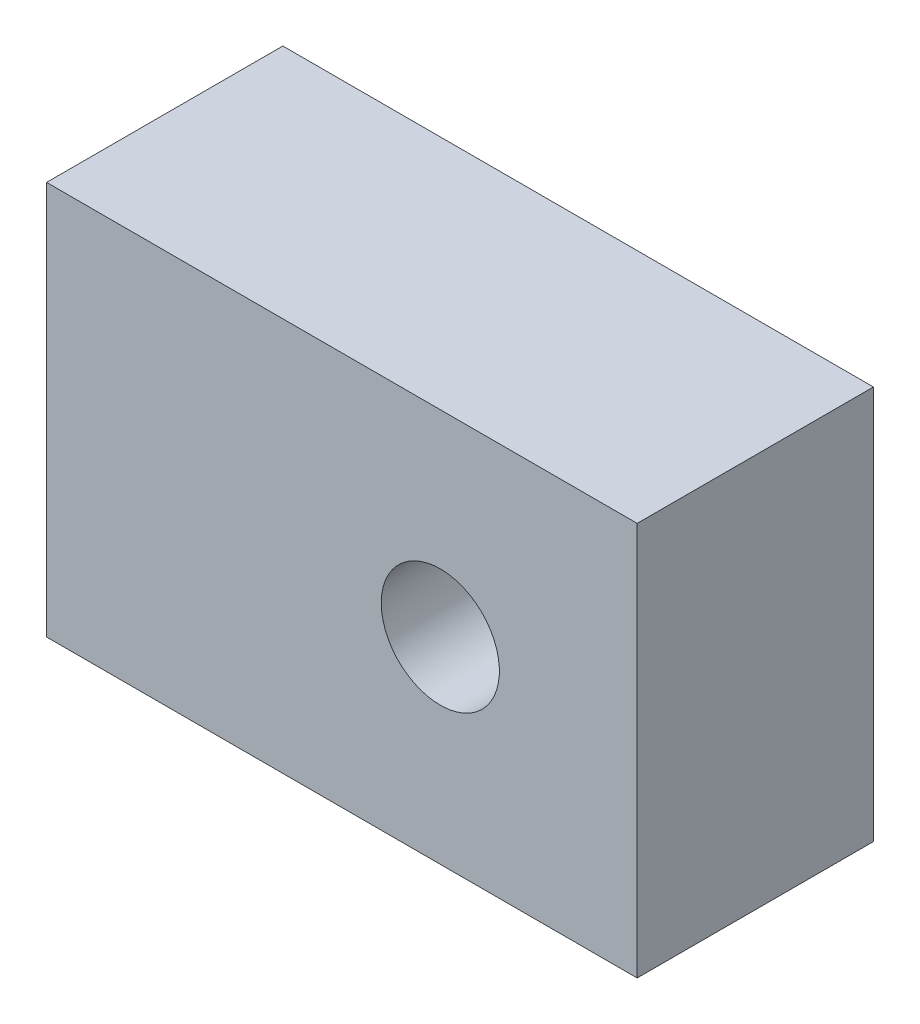
ISO-10303-21;
HEADER;
FILE_DESCRIPTION(('STEP AP214'),'2;1');
FILE_NAME('part.step','',(''),(''),'','','');
FILE_SCHEMA(('AUTOMOTIVE_DESIGN { 1 0 10303 214 1 1 1 1 }'));
ENDSEC;
DATA;
#1=APPLICATION_CONTEXT('core data for automotive mechanical design processes');
#2=APPLICATION_PROTOCOL_DEFINITION('international standard','automotive_design',2000,#1);
#3=PRODUCT_CONTEXT('',#1,'mechanical');
#4=PRODUCT('Part','Part','',(#3));
#5=PRODUCT_RELATED_PRODUCT_CATEGORY('part','',(#4));
#6=PRODUCT_DEFINITION_FORMATION('','',#4);
#7=PRODUCT_DEFINITION_CONTEXT('part definition',#1,'design');
#8=PRODUCT_DEFINITION('design','',#6,#7);
#9=PRODUCT_DEFINITION_SHAPE('','',#8);
#10=(LENGTH_UNIT() NAMED_UNIT(*) SI_UNIT(.MILLI.,.METRE.));
#11=(NAMED_UNIT(*) PLANE_ANGLE_UNIT() SI_UNIT($,.RADIAN.));
#12=(NAMED_UNIT(*) SI_UNIT($,.STERADIAN.) SOLID_ANGLE_UNIT());
#13=UNCERTAINTY_MEASURE_WITH_UNIT(LENGTH_MEASURE(1.E-05),#10,'distance_accuracy_value','');
#14=(GEOMETRIC_REPRESENTATION_CONTEXT(3) GLOBAL_UNCERTAINTY_ASSIGNED_CONTEXT((#13)) GLOBAL_UNIT_ASSIGNED_CONTEXT((#10,
#11,#12)) REPRESENTATION_CONTEXT('',''));
#15=CARTESIAN_POINT('',(0.,0.,0.));
#16=DIRECTION('',(0.,0.,1.));
#17=DIRECTION('',(1.,0.,0.));
#18=AXIS2_PLACEMENT_3D('',#15,#16,#17);
#19=CARTESIAN_POINT('',(0.,0.,6.));
#20=DIRECTION('',(1.,0.,0.));
#21=DIRECTION('',(0.,0.,-1.));
#22=AXIS2_PLACEMENT_3D('',#19,#20,#21);
#23=PLANE('',#22);
#24=DIRECTION('',(0.,-1.,0.));
#25=VECTOR('',#24,1.);
#26=CARTESIAN_POINT('',(0.,0.,0.));
#27=LINE('',#26,#25);
#28=CARTESIAN_POINT('',(0.,10.,0.));
#29=VERTEX_POINT('',#28);
#30=CARTESIAN_POINT('',(0.,0.,0.));
#31=VERTEX_POINT('',#30);
#32=EDGE_CURVE('E106',#29,#31,#27,.T.);
#33=ORIENTED_EDGE('',*,*,#32,.T.);
#34=DIRECTION('',(0.,0.,-1.));
#35=VECTOR('',#34,1.);
#36=CARTESIAN_POINT('',(0.,0.,6.));
#37=LINE('',#36,#35);
#38=CARTESIAN_POINT('',(0.,0.,6.));
#39=VERTEX_POINT('',#38);
#40=EDGE_CURVE('E11',#39,#31,#37,.T.);
#41=ORIENTED_EDGE('',*,*,#40,.F.);
#42=DIRECTION('',(0.,-1.,0.));
#43=VECTOR('',#42,1.);
#44=CARTESIAN_POINT('',(0.,0.,6.));
#45=LINE('',#44,#43);
#46=CARTESIAN_POINT('',(0.,10.,6.));
#47=VERTEX_POINT('',#46);
#48=EDGE_CURVE('E90',#47,#39,#45,.T.);
#49=ORIENTED_EDGE('',*,*,#48,.F.);
#50=DIRECTION('',(0.,0.,-1.));
#51=VECTOR('',#50,1.);
#52=CARTESIAN_POINT('',(0.,10.,6.));
#53=LINE('',#52,#51);
#54=EDGE_CURVE('E102',#47,#29,#53,.T.);
#55=ORIENTED_EDGE('',*,*,#54,.T.);
#56=EDGE_LOOP('',(#33,#41,#49,#55));
#57=FACE_BOUND('',#56,.T.);
#58=ADVANCED_FACE('F38',(#57),#23,.F.);
#59=CARTESIAN_POINT('',(0.,0.,6.));
#60=DIRECTION('',(0.,1.,0.));
#61=DIRECTION('',(0.,0.,1.));
#62=AXIS2_PLACEMENT_3D('',#59,#60,#61);
#63=PLANE('',#62);
#64=DIRECTION('',(1.,0.,0.));
#65=VECTOR('',#64,1.);
#66=CARTESIAN_POINT('',(0.,0.,0.));
#67=LINE('',#66,#65);
#68=CARTESIAN_POINT('',(15.,0.,0.));
#69=VERTEX_POINT('',#68);
#70=EDGE_CURVE('E95',#31,#69,#67,.T.);
#71=ORIENTED_EDGE('',*,*,#70,.T.);
#72=DIRECTION('',(0.,0.,-1.));
#73=VECTOR('',#72,1.);
#74=CARTESIAN_POINT('',(15.,0.,6.));
#75=LINE('',#74,#73);
#76=CARTESIAN_POINT('',(15.,0.,6.));
#77=VERTEX_POINT('',#76);
#78=EDGE_CURVE('E47',#77,#69,#75,.T.);
#79=ORIENTED_EDGE('',*,*,#78,.F.);
#80=DIRECTION('',(1.,0.,0.));
#81=VECTOR('',#80,1.);
#82=CARTESIAN_POINT('',(0.,0.,6.));
#83=LINE('',#82,#81);
#84=EDGE_CURVE('E85',#39,#77,#83,.T.);
#85=ORIENTED_EDGE('',*,*,#84,.F.);
#86=ORIENTED_EDGE('',*,*,#40,.T.);
#87=EDGE_LOOP('',(#71,#79,#85,#86));
#88=FACE_BOUND('',#87,.T.);
#89=ADVANCED_FACE('F94',(#88),#63,.F.);
#90=CARTESIAN_POINT('',(15.,0.,6.));
#91=DIRECTION('',(-1.,0.,0.));
#92=DIRECTION('',(0.,0.,1.));
#93=AXIS2_PLACEMENT_3D('',#90,#91,#92);
#94=PLANE('',#93);
#95=DIRECTION('',(0.,1.,0.));
#96=VECTOR('',#95,1.);
#97=CARTESIAN_POINT('',(15.,0.,0.));
#98=LINE('',#97,#96);
#99=CARTESIAN_POINT('',(15.,10.,0.));
#100=VERTEX_POINT('',#99);
#101=EDGE_CURVE('E72',#69,#100,#98,.T.);
#102=ORIENTED_EDGE('',*,*,#101,.T.);
#103=DIRECTION('',(0.,0.,-1.));
#104=VECTOR('',#103,1.);
#105=CARTESIAN_POINT('',(15.,10.,6.));
#106=LINE('',#105,#104);
#107=CARTESIAN_POINT('',(15.,10.,6.));
#108=VERTEX_POINT('',#107);
#109=EDGE_CURVE('E97',#108,#100,#106,.T.);
#110=ORIENTED_EDGE('',*,*,#109,.F.);
#111=DIRECTION('',(0.,1.,0.));
#112=VECTOR('',#111,1.);
#113=CARTESIAN_POINT('',(15.,0.,6.));
#114=LINE('',#113,#112);
#115=EDGE_CURVE('E88',#77,#108,#114,.T.);
#116=ORIENTED_EDGE('',*,*,#115,.F.);
#117=ORIENTED_EDGE('',*,*,#78,.T.);
#118=EDGE_LOOP('',(#102,#110,#116,#117));
#119=FACE_BOUND('',#118,.T.);
#120=ADVANCED_FACE('F98',(#119),#94,.F.);
#121=CARTESIAN_POINT('',(0.,10.,6.));
#122=DIRECTION('',(0.,-1.,0.));
#123=DIRECTION('',(0.,0.,-1.));
#124=AXIS2_PLACEMENT_3D('',#121,#122,#123);
#125=PLANE('',#124);
#126=DIRECTION('',(-1.,0.,0.));
#127=VECTOR('',#126,1.);
#128=CARTESIAN_POINT('',(0.,10.,0.));
#129=LINE('',#128,#127);
#130=EDGE_CURVE('E78',#100,#29,#129,.T.);
#131=ORIENTED_EDGE('',*,*,#130,.T.);
#132=ORIENTED_EDGE('',*,*,#54,.F.);
#133=DIRECTION('',(-1.,0.,0.));
#134=VECTOR('',#133,1.);
#135=CARTESIAN_POINT('',(0.,10.,6.));
#136=LINE('',#135,#134);
#137=EDGE_CURVE('E55',#108,#47,#136,.T.);
#138=ORIENTED_EDGE('',*,*,#137,.F.);
#139=ORIENTED_EDGE('',*,*,#109,.T.);
#140=EDGE_LOOP('',(#131,#132,#138,#139));
#141=FACE_BOUND('',#140,.T.);
#142=ADVANCED_FACE('F120',(#141),#125,.F.);
#143=CARTESIAN_POINT('',(0.,0.,6.));
#144=DIRECTION('',(0.,0.,-1.));
#145=DIRECTION('',(-1.,0.,0.));
#146=AXIS2_PLACEMENT_3D('',#143,#144,#145);
#147=PLANE('',#146);
#148=CARTESIAN_POINT('',(10.,5.,6.));
#149=DIRECTION('',(0.,0.,-1.));
#150=DIRECTION('',(-1.,0.,0.));
#151=AXIS2_PLACEMENT_3D('',#148,#149,#150);
#152=CIRCLE('',#151,1.5);
#153=CARTESIAN_POINT('',(8.5,5.,6.));
#154=VERTEX_POINT('',#153);
#155=EDGE_CURVE('E110',#154,#154,#152,.T.);
#156=ORIENTED_EDGE('',*,*,#155,.T.);
#157=EDGE_LOOP('',(#156));
#158=FACE_BOUND('',#157,.T.);
#159=ORIENTED_EDGE('',*,*,#48,.T.);
#160=ORIENTED_EDGE('',*,*,#84,.T.);
#161=ORIENTED_EDGE('',*,*,#115,.T.);
#162=ORIENTED_EDGE('',*,*,#137,.T.);
#163=EDGE_LOOP('',(#159,#160,#161,#162));
#164=FACE_BOUND('',#163,.T.);
#165=ADVANCED_FACE('F86',(#158,#164),#147,.F.);
#166=CARTESIAN_POINT('',(0.,0.,0.));
#167=DIRECTION('',(0.,0.,-1.));
#168=DIRECTION('',(-1.,0.,0.));
#169=AXIS2_PLACEMENT_3D('',#166,#167,#168);
#170=PLANE('',#169);
#171=CARTESIAN_POINT('',(10.,5.,0.));
#172=DIRECTION('',(0.,0.,-1.));
#173=DIRECTION('',(-1.,0.,0.));
#174=AXIS2_PLACEMENT_3D('',#171,#172,#173);
#175=CIRCLE('',#174,1.5);
#176=CARTESIAN_POINT('',(8.5,5.,0.));
#177=VERTEX_POINT('',#176);
#178=EDGE_CURVE('E127',#177,#177,#175,.T.);
#179=ORIENTED_EDGE('',*,*,#178,.F.);
#180=EDGE_LOOP('',(#179));
#181=FACE_BOUND('',#180,.T.);
#182=ORIENTED_EDGE('',*,*,#32,.F.);
#183=ORIENTED_EDGE('',*,*,#130,.F.);
#184=ORIENTED_EDGE('',*,*,#101,.F.);
#185=ORIENTED_EDGE('',*,*,#70,.F.);
#186=EDGE_LOOP('',(#182,#183,#184,#185));
#187=FACE_BOUND('',#186,.T.);
#188=ADVANCED_FACE('F123',(#181,#187),#170,.T.);
#189=CARTESIAN_POINT('',(10.,5.,6.));
#190=DIRECTION('',(0.,0.,-1.));
#191=DIRECTION('',(-1.,0.,0.));
#192=AXIS2_PLACEMENT_3D('',#189,#190,#191);
#193=CYLINDRICAL_SURFACE('',#192,1.5);
#194=ORIENTED_EDGE('',*,*,#155,.F.);
#195=EDGE_LOOP('',(#194));
#196=FACE_BOUND('',#195,.T.);
#197=ORIENTED_EDGE('',*,*,#178,.T.);
#198=EDGE_LOOP('',(#197));
#199=FACE_BOUND('',#198,.T.);
#200=ADVANCED_FACE('F136',(#196,#199),#193,.F.);
#201=CLOSED_SHELL('',(#58,#89,#120,#142,#165,#188,#200));
#202=MANIFOLD_SOLID_BREP('B2',#201);
#203=ADVANCED_BREP_SHAPE_REPRESENTATION('',(#18,#202),#14);
#204=SHAPE_DEFINITION_REPRESENTATION(#9,#203);
ENDSEC;
END-ISO-10303-21;
